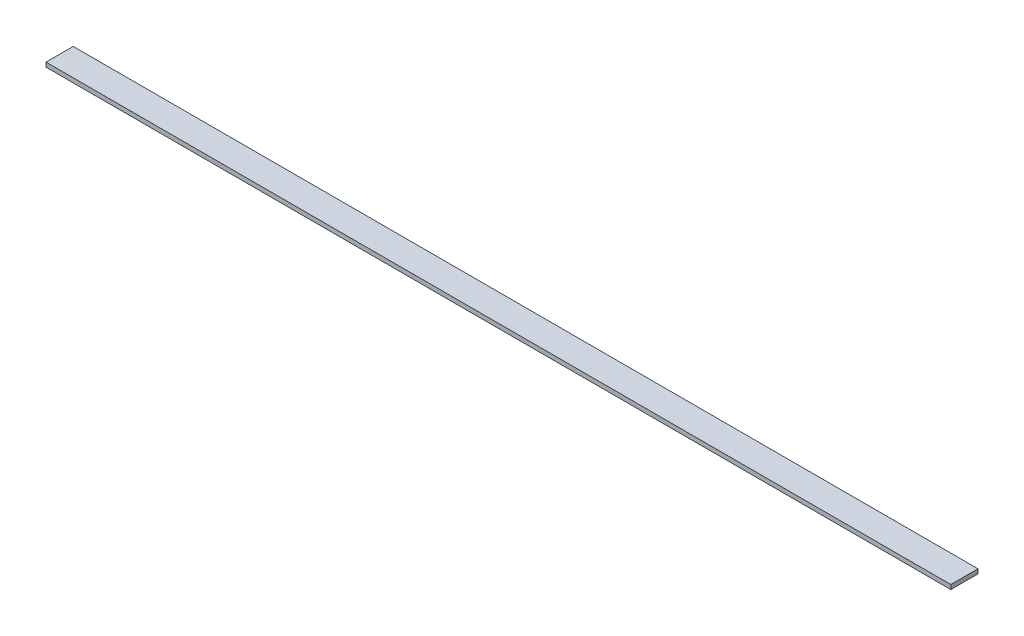
ISO-10303-21;
HEADER;
FILE_DESCRIPTION(('STEP AP214'),'2;1');
FILE_NAME('part.step','',(''),(''),'','','');
FILE_SCHEMA(('AUTOMOTIVE_DESIGN { 1 0 10303 214 1 1 1 1 }'));
ENDSEC;
DATA;
#1=APPLICATION_CONTEXT('core data for automotive mechanical design processes');
#2=APPLICATION_PROTOCOL_DEFINITION('international standard','automotive_design',2000,#1);
#3=PRODUCT_CONTEXT('',#1,'mechanical');
#4=PRODUCT('Part','Part','',(#3));
#5=PRODUCT_RELATED_PRODUCT_CATEGORY('part','',(#4));
#6=PRODUCT_DEFINITION_FORMATION('','',#4);
#7=PRODUCT_DEFINITION_CONTEXT('part definition',#1,'design');
#8=PRODUCT_DEFINITION('design','',#6,#7);
#9=PRODUCT_DEFINITION_SHAPE('','',#8);
#10=(LENGTH_UNIT() NAMED_UNIT(*) SI_UNIT(.MILLI.,.METRE.));
#11=(NAMED_UNIT(*) PLANE_ANGLE_UNIT() SI_UNIT($,.RADIAN.));
#12=(NAMED_UNIT(*) SI_UNIT($,.STERADIAN.) SOLID_ANGLE_UNIT());
#13=UNCERTAINTY_MEASURE_WITH_UNIT(LENGTH_MEASURE(1.E-05),#10,'distance_accuracy_value','');
#14=(GEOMETRIC_REPRESENTATION_CONTEXT(3) GLOBAL_UNCERTAINTY_ASSIGNED_CONTEXT((#13)) GLOBAL_UNIT_ASSIGNED_CONTEXT((#10,
#11,#12)) REPRESENTATION_CONTEXT('',''));
#15=CARTESIAN_POINT('',(0.,0.,0.));
#16=DIRECTION('',(0.,0.,1.));
#17=DIRECTION('',(1.,0.,0.));
#18=AXIS2_PLACEMENT_3D('',#15,#16,#17);
#19=CARTESIAN_POINT('',(-2175.76235658668,21.5899999999998,-532.673586118252));
#20=DIRECTION('',(1.,0.,0.));
#21=DIRECTION('',(0.,0.,-1.));
#22=AXIS2_PLACEMENT_3D('',#19,#20,#21);
#23=PLANE('',#22);
#24=DIRECTION('',(0.,0.,1.));
#25=VECTOR('',#24,1.);
#26=CARTESIAN_POINT('',(-2175.76235658668,0.,-532.673586118252));
#27=LINE('',#26,#25);
#28=CARTESIAN_POINT('',(-2175.76235658668,0.,-532.673586118252));
#29=VERTEX_POINT('',#28);
#30=CARTESIAN_POINT('',(-2175.76235658668,0.,-399.323586118252));
#31=VERTEX_POINT('',#30);
#32=EDGE_CURVE('E95',#29,#31,#27,.T.);
#33=ORIENTED_EDGE('',*,*,#32,.T.);
#34=DIRECTION('',(0.,-1.,0.));
#35=VECTOR('',#34,1.);
#36=CARTESIAN_POINT('',(-2175.76235658668,21.5899999999998,-399.323586118252));
#37=LINE('',#36,#35);
#38=CARTESIAN_POINT('',(-2175.76235658668,21.5899999999998,-399.323586118252));
#39=VERTEX_POINT('',#38);
#40=EDGE_CURVE('E11',#39,#31,#37,.T.);
#41=ORIENTED_EDGE('',*,*,#40,.F.);
#42=DIRECTION('',(0.,0.,1.));
#43=VECTOR('',#42,1.);
#44=CARTESIAN_POINT('',(-2175.76235658668,21.5899999999998,-532.673586118252));
#45=LINE('',#44,#43);
#46=CARTESIAN_POINT('',(-2175.76235658668,21.5899999999998,-532.673586118252));
#47=VERTEX_POINT('',#46);
#48=EDGE_CURVE('E81',#47,#39,#45,.T.);
#49=ORIENTED_EDGE('',*,*,#48,.F.);
#50=DIRECTION('',(0.,-1.,0.));
#51=VECTOR('',#50,1.);
#52=CARTESIAN_POINT('',(-2175.76235658668,21.5899999999998,-532.673586118252));
#53=LINE('',#52,#51);
#54=EDGE_CURVE('E48',#47,#29,#53,.T.);
#55=ORIENTED_EDGE('',*,*,#54,.T.);
#56=EDGE_LOOP('',(#33,#41,#49,#55));
#57=FACE_BOUND('',#56,.T.);
#58=ADVANCED_FACE('F32',(#57),#23,.F.);
#59=CARTESIAN_POINT('',(-2175.76235658668,21.5899999999998,-399.323586118252));
#60=DIRECTION('',(0.,0.,-1.));
#61=DIRECTION('',(-1.,0.,0.));
#62=AXIS2_PLACEMENT_3D('',#59,#60,#61);
#63=PLANE('',#62);
#64=DIRECTION('',(1.,0.,0.));
#65=VECTOR('',#64,1.);
#66=CARTESIAN_POINT('',(-2175.76235658668,0.,-399.323586118252));
#67=LINE('',#66,#65);
#68=CARTESIAN_POINT('',(2261.30014341332,0.,-399.323586118252));
#69=VERTEX_POINT('',#68);
#70=EDGE_CURVE('E86',#31,#69,#67,.T.);
#71=ORIENTED_EDGE('',*,*,#70,.T.);
#72=DIRECTION('',(0.,-1.,0.));
#73=VECTOR('',#72,1.);
#74=CARTESIAN_POINT('',(2261.30014341332,21.5899999999998,-399.323586118252));
#75=LINE('',#74,#73);
#76=CARTESIAN_POINT('',(2261.30014341332,21.5899999999998,-399.323586118252));
#77=VERTEX_POINT('',#76);
#78=EDGE_CURVE('E40',#77,#69,#75,.T.);
#79=ORIENTED_EDGE('',*,*,#78,.F.);
#80=DIRECTION('',(1.,0.,0.));
#81=VECTOR('',#80,1.);
#82=CARTESIAN_POINT('',(-2175.76235658668,21.5899999999998,-399.323586118252));
#83=LINE('',#82,#81);
#84=EDGE_CURVE('E73',#39,#77,#83,.T.);
#85=ORIENTED_EDGE('',*,*,#84,.F.);
#86=ORIENTED_EDGE('',*,*,#40,.T.);
#87=EDGE_LOOP('',(#71,#79,#85,#86));
#88=FACE_BOUND('',#87,.T.);
#89=ADVANCED_FACE('F85',(#88),#63,.F.);
#90=CARTESIAN_POINT('',(2261.30014341332,21.5899999999998,-532.673586118252));
#91=DIRECTION('',(1.,0.,0.));
#92=DIRECTION('',(0.,0.,-1.));
#93=AXIS2_PLACEMENT_3D('',#90,#91,#92);
#94=PLANE('',#93);
#95=DIRECTION('',(0.,0.,1.));
#96=VECTOR('',#95,1.);
#97=CARTESIAN_POINT('',(2261.30014341332,0.,-532.673586118252));
#98=LINE('',#97,#96);
#99=CARTESIAN_POINT('',(2261.30014341332,0.,-532.673586118252));
#100=VERTEX_POINT('',#99);
#101=EDGE_CURVE('E98',#100,#69,#98,.T.);
#102=ORIENTED_EDGE('',*,*,#101,.F.);
#103=DIRECTION('',(0.,-1.,0.));
#104=VECTOR('',#103,1.);
#105=CARTESIAN_POINT('',(2261.30014341332,21.5899999999998,-532.673586118252));
#106=LINE('',#105,#104);
#107=CARTESIAN_POINT('',(2261.30014341332,21.5899999999998,-532.673586118252));
#108=VERTEX_POINT('',#107);
#109=EDGE_CURVE('E62',#108,#100,#106,.T.);
#110=ORIENTED_EDGE('',*,*,#109,.F.);
#111=DIRECTION('',(0.,0.,1.));
#112=VECTOR('',#111,1.);
#113=CARTESIAN_POINT('',(2261.30014341332,21.5899999999998,-532.673586118252));
#114=LINE('',#113,#112);
#115=EDGE_CURVE('E80',#108,#77,#114,.T.);
#116=ORIENTED_EDGE('',*,*,#115,.T.);
#117=ORIENTED_EDGE('',*,*,#78,.T.);
#118=EDGE_LOOP('',(#102,#110,#116,#117));
#119=FACE_BOUND('',#118,.T.);
#120=ADVANCED_FACE('F89',(#119),#94,.T.);
#121=CARTESIAN_POINT('',(-2175.76235658668,21.5899999999998,-532.673586118252));
#122=DIRECTION('',(0.,0.,-1.));
#123=DIRECTION('',(-1.,0.,0.));
#124=AXIS2_PLACEMENT_3D('',#121,#122,#123);
#125=PLANE('',#124);
#126=DIRECTION('',(1.,0.,0.));
#127=VECTOR('',#126,1.);
#128=CARTESIAN_POINT('',(-2175.76235658668,0.,-532.673586118252));
#129=LINE('',#128,#127);
#130=EDGE_CURVE('E100',#29,#100,#129,.T.);
#131=ORIENTED_EDGE('',*,*,#130,.F.);
#132=ORIENTED_EDGE('',*,*,#54,.F.);
#133=DIRECTION('',(1.,0.,0.));
#134=VECTOR('',#133,1.);
#135=CARTESIAN_POINT('',(-2175.76235658668,21.5899999999998,-532.673586118252));
#136=LINE('',#135,#134);
#137=EDGE_CURVE('E90',#47,#108,#136,.T.);
#138=ORIENTED_EDGE('',*,*,#137,.T.);
#139=ORIENTED_EDGE('',*,*,#109,.T.);
#140=EDGE_LOOP('',(#131,#132,#138,#139));
#141=FACE_BOUND('',#140,.T.);
#142=ADVANCED_FACE('F106',(#141),#125,.T.);
#143=CARTESIAN_POINT('',(0.,21.5899999999998,0.));
#144=DIRECTION('',(0.,1.,0.));
#145=DIRECTION('',(0.,0.,1.));
#146=AXIS2_PLACEMENT_3D('',#143,#144,#145);
#147=PLANE('',#146);
#148=ORIENTED_EDGE('',*,*,#48,.T.);
#149=ORIENTED_EDGE('',*,*,#84,.T.);
#150=ORIENTED_EDGE('',*,*,#115,.F.);
#151=ORIENTED_EDGE('',*,*,#137,.F.);
#152=EDGE_LOOP('',(#148,#149,#150,#151));
#153=FACE_BOUND('',#152,.T.);
#154=ADVANCED_FACE('F77',(#153),#147,.T.);
#155=CARTESIAN_POINT('',(0.,0.,0.));
#156=DIRECTION('',(0.,1.,0.));
#157=DIRECTION('',(0.,0.,1.));
#158=AXIS2_PLACEMENT_3D('',#155,#156,#157);
#159=PLANE('',#158);
#160=ORIENTED_EDGE('',*,*,#32,.F.);
#161=ORIENTED_EDGE('',*,*,#130,.T.);
#162=ORIENTED_EDGE('',*,*,#101,.T.);
#163=ORIENTED_EDGE('',*,*,#70,.F.);
#164=EDGE_LOOP('',(#160,#161,#162,#163));
#165=FACE_BOUND('',#164,.T.);
#166=ADVANCED_FACE('F105',(#165),#159,.F.);
#167=CLOSED_SHELL('',(#58,#89,#120,#142,#154,#166));
#168=MANIFOLD_SOLID_BREP('B2',#167);
#169=ADVANCED_BREP_SHAPE_REPRESENTATION('',(#18,#168),#14);
#170=SHAPE_DEFINITION_REPRESENTATION(#9,#169);
ENDSEC;
END-ISO-10303-21;
